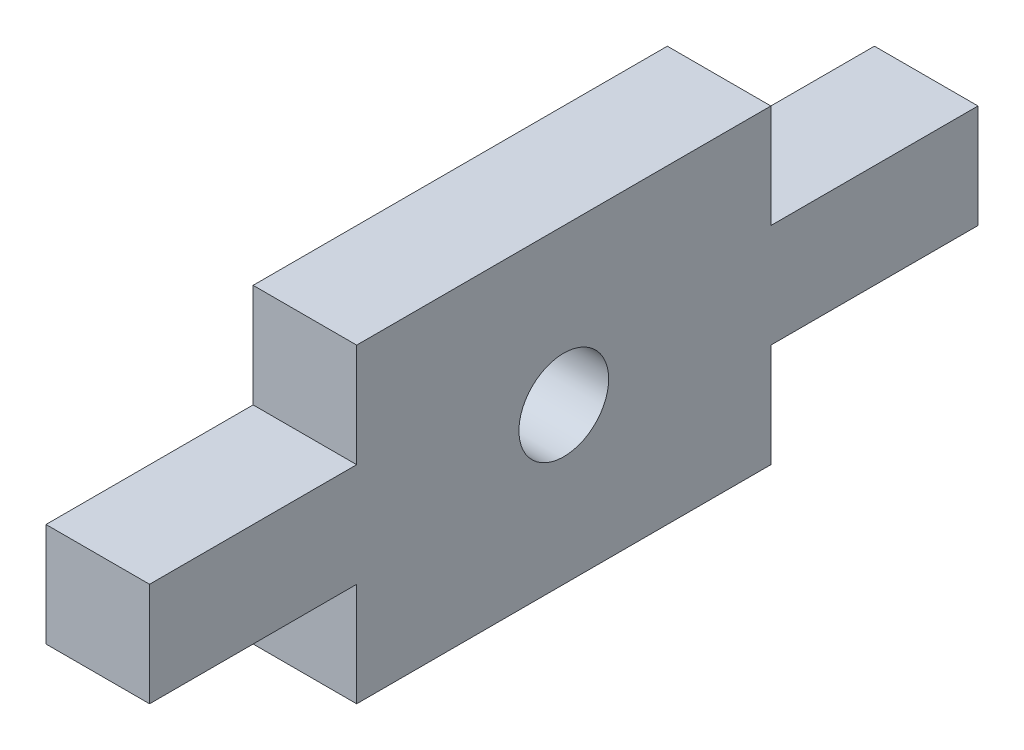
ISO-10303-21;
HEADER;
FILE_DESCRIPTION(('STEP AP214'),'2;1');
FILE_NAME('part.step','',(''),(''),'','','');
FILE_SCHEMA(('AUTOMOTIVE_DESIGN { 1 0 10303 214 1 1 1 1 }'));
ENDSEC;
DATA;
#1=APPLICATION_CONTEXT('core data for automotive mechanical design processes');
#2=APPLICATION_PROTOCOL_DEFINITION('international standard','automotive_design',2000,#1);
#3=PRODUCT_CONTEXT('',#1,'mechanical');
#4=PRODUCT('Part','Part','',(#3));
#5=PRODUCT_RELATED_PRODUCT_CATEGORY('part','',(#4));
#6=PRODUCT_DEFINITION_FORMATION('','',#4);
#7=PRODUCT_DEFINITION_CONTEXT('part definition',#1,'design');
#8=PRODUCT_DEFINITION('design','',#6,#7);
#9=PRODUCT_DEFINITION_SHAPE('','',#8);
#10=(LENGTH_UNIT() NAMED_UNIT(*) SI_UNIT(.MILLI.,.METRE.));
#11=(NAMED_UNIT(*) PLANE_ANGLE_UNIT() SI_UNIT($,.RADIAN.));
#12=(NAMED_UNIT(*) SI_UNIT($,.STERADIAN.) SOLID_ANGLE_UNIT());
#13=UNCERTAINTY_MEASURE_WITH_UNIT(LENGTH_MEASURE(1.E-05),#10,'distance_accuracy_value','');
#14=(GEOMETRIC_REPRESENTATION_CONTEXT(3) GLOBAL_UNCERTAINTY_ASSIGNED_CONTEXT((#13)) GLOBAL_UNIT_ASSIGNED_CONTEXT((#10,
#11,#12)) REPRESENTATION_CONTEXT('',''));
#15=CARTESIAN_POINT('',(0.,0.,0.));
#16=DIRECTION('',(0.,0.,1.));
#17=DIRECTION('',(1.,0.,0.));
#18=AXIS2_PLACEMENT_3D('',#15,#16,#17);
#19=CARTESIAN_POINT('',(3.,0.,-6.));
#20=DIRECTION('',(0.,0.,-1.));
#21=DIRECTION('',(-1.,0.,0.));
#22=AXIS2_PLACEMENT_3D('',#19,#20,#21);
#23=PLANE('',#22);
#24=DIRECTION('',(0.,-1.,0.));
#25=VECTOR('',#24,1.);
#26=CARTESIAN_POINT('',(0.,0.,-6.));
#27=LINE('',#26,#25);
#28=CARTESIAN_POINT('',(0.,4.5,-6.));
#29=VERTEX_POINT('',#28);
#30=CARTESIAN_POINT('',(0.,1.5,-6.));
#31=VERTEX_POINT('',#30);
#32=EDGE_CURVE('E154',#29,#31,#27,.T.);
#33=ORIENTED_EDGE('',*,*,#32,.F.);
#34=DIRECTION('',(-1.,0.,0.));
#35=VECTOR('',#34,1.);
#36=CARTESIAN_POINT('',(3.,4.5,-6.));
#37=LINE('',#36,#35);
#38=CARTESIAN_POINT('',(3.,4.5,-6.));
#39=VERTEX_POINT('',#38);
#40=EDGE_CURVE('E11',#39,#29,#37,.T.);
#41=ORIENTED_EDGE('',*,*,#40,.F.);
#42=DIRECTION('',(0.,-1.,0.));
#43=VECTOR('',#42,1.);
#44=CARTESIAN_POINT('',(3.,0.,-6.));
#45=LINE('',#44,#43);
#46=CARTESIAN_POINT('',(3.,1.5,-6.));
#47=VERTEX_POINT('',#46);
#48=EDGE_CURVE('E214',#39,#47,#45,.T.);
#49=ORIENTED_EDGE('',*,*,#48,.T.);
#50=DIRECTION('',(-1.,0.,0.));
#51=VECTOR('',#50,1.);
#52=CARTESIAN_POINT('',(3.,1.5,-6.));
#53=LINE('',#52,#51);
#54=EDGE_CURVE('E50',#47,#31,#53,.T.);
#55=ORIENTED_EDGE('',*,*,#54,.T.);
#56=EDGE_LOOP('',(#33,#41,#49,#55));
#57=FACE_BOUND('',#56,.T.);
#58=ADVANCED_FACE('F34',(#57),#23,.T.);
#59=CARTESIAN_POINT('',(3.,4.5,0.));
#60=DIRECTION('',(0.,1.,0.));
#61=DIRECTION('',(0.,0.,1.));
#62=AXIS2_PLACEMENT_3D('',#59,#60,#61);
#63=PLANE('',#62);
#64=DIRECTION('',(0.,0.,-1.));
#65=VECTOR('',#64,1.);
#66=CARTESIAN_POINT('',(0.,4.5,0.));
#67=LINE('',#66,#65);
#68=CARTESIAN_POINT('',(0.,4.5,6.));
#69=VERTEX_POINT('',#68);
#70=EDGE_CURVE('E156',#69,#29,#67,.T.);
#71=ORIENTED_EDGE('',*,*,#70,.F.);
#72=DIRECTION('',(-1.,0.,0.));
#73=VECTOR('',#72,1.);
#74=CARTESIAN_POINT('',(3.,4.5,6.));
#75=LINE('',#74,#73);
#76=CARTESIAN_POINT('',(3.,4.5,6.));
#77=VERTEX_POINT('',#76);
#78=EDGE_CURVE('E42',#77,#69,#75,.T.);
#79=ORIENTED_EDGE('',*,*,#78,.F.);
#80=DIRECTION('',(0.,0.,-1.));
#81=VECTOR('',#80,1.);
#82=CARTESIAN_POINT('',(3.,4.5,0.));
#83=LINE('',#82,#81);
#84=EDGE_CURVE('E211',#77,#39,#83,.T.);
#85=ORIENTED_EDGE('',*,*,#84,.T.);
#86=ORIENTED_EDGE('',*,*,#40,.T.);
#87=EDGE_LOOP('',(#71,#79,#85,#86));
#88=FACE_BOUND('',#87,.T.);
#89=ADVANCED_FACE('F210',(#88),#63,.T.);
#90=CARTESIAN_POINT('',(3.,0.,6.));
#91=DIRECTION('',(0.,0.,-1.));
#92=DIRECTION('',(-1.,0.,0.));
#93=AXIS2_PLACEMENT_3D('',#90,#91,#92);
#94=PLANE('',#93);
#95=DIRECTION('',(0.,-1.,0.));
#96=VECTOR('',#95,1.);
#97=CARTESIAN_POINT('',(0.,0.,6.));
#98=LINE('',#97,#96);
#99=CARTESIAN_POINT('',(0.,1.5,6.));
#100=VERTEX_POINT('',#99);
#101=EDGE_CURVE('E160',#69,#100,#98,.T.);
#102=ORIENTED_EDGE('',*,*,#101,.T.);
#103=DIRECTION('',(-1.,0.,0.));
#104=VECTOR('',#103,1.);
#105=CARTESIAN_POINT('',(3.,1.5,6.));
#106=LINE('',#105,#104);
#107=CARTESIAN_POINT('',(3.,1.5,6.));
#108=VERTEX_POINT('',#107);
#109=EDGE_CURVE('E196',#108,#100,#106,.T.);
#110=ORIENTED_EDGE('',*,*,#109,.F.);
#111=DIRECTION('',(0.,-1.,0.));
#112=VECTOR('',#111,1.);
#113=CARTESIAN_POINT('',(3.,0.,6.));
#114=LINE('',#113,#112);
#115=EDGE_CURVE('E202',#77,#108,#114,.T.);
#116=ORIENTED_EDGE('',*,*,#115,.F.);
#117=ORIENTED_EDGE('',*,*,#78,.T.);
#118=EDGE_LOOP('',(#102,#110,#116,#117));
#119=FACE_BOUND('',#118,.T.);
#120=ADVANCED_FACE('F200',(#119),#94,.F.);
#121=CARTESIAN_POINT('',(3.,1.5,0.));
#122=DIRECTION('',(0.,1.,0.));
#123=DIRECTION('',(0.,0.,1.));
#124=AXIS2_PLACEMENT_3D('',#121,#122,#123);
#125=PLANE('',#124);
#126=DIRECTION('',(0.,0.,-1.));
#127=VECTOR('',#126,1.);
#128=CARTESIAN_POINT('',(0.,1.5,0.));
#129=LINE('',#128,#127);
#130=CARTESIAN_POINT('',(0.,1.5,12.));
#131=VERTEX_POINT('',#130);
#132=EDGE_CURVE('E163',#131,#100,#129,.T.);
#133=ORIENTED_EDGE('',*,*,#132,.F.);
#134=DIRECTION('',(-1.,0.,0.));
#135=VECTOR('',#134,1.);
#136=CARTESIAN_POINT('',(3.,1.5,12.));
#137=LINE('',#136,#135);
#138=CARTESIAN_POINT('',(3.,1.5,12.));
#139=VERTEX_POINT('',#138);
#140=EDGE_CURVE('E194',#139,#131,#137,.T.);
#141=ORIENTED_EDGE('',*,*,#140,.F.);
#142=DIRECTION('',(0.,0.,-1.));
#143=VECTOR('',#142,1.);
#144=CARTESIAN_POINT('',(3.,1.5,0.));
#145=LINE('',#144,#143);
#146=EDGE_CURVE('E150',#139,#108,#145,.T.);
#147=ORIENTED_EDGE('',*,*,#146,.T.);
#148=ORIENTED_EDGE('',*,*,#109,.T.);
#149=EDGE_LOOP('',(#133,#141,#147,#148));
#150=FACE_BOUND('',#149,.T.);
#151=ADVANCED_FACE('F251',(#150),#125,.T.);
#152=CARTESIAN_POINT('',(3.,0.,12.));
#153=DIRECTION('',(0.,0.,1.));
#154=DIRECTION('',(1.,0.,0.));
#155=AXIS2_PLACEMENT_3D('',#152,#153,#154);
#156=PLANE('',#155);
#157=DIRECTION('',(0.,1.,0.));
#158=VECTOR('',#157,1.);
#159=CARTESIAN_POINT('',(0.,0.,12.));
#160=LINE('',#159,#158);
#161=CARTESIAN_POINT('',(0.,-1.5,12.));
#162=VERTEX_POINT('',#161);
#163=EDGE_CURVE('E166',#162,#131,#160,.T.);
#164=ORIENTED_EDGE('',*,*,#163,.F.);
#165=DIRECTION('',(-1.,0.,0.));
#166=VECTOR('',#165,1.);
#167=CARTESIAN_POINT('',(3.,-1.5,12.));
#168=LINE('',#167,#166);
#169=CARTESIAN_POINT('',(3.,-1.5,12.));
#170=VERTEX_POINT('',#169);
#171=EDGE_CURVE('E192',#170,#162,#168,.T.);
#172=ORIENTED_EDGE('',*,*,#171,.F.);
#173=DIRECTION('',(0.,1.,0.));
#174=VECTOR('',#173,1.);
#175=CARTESIAN_POINT('',(3.,0.,12.));
#176=LINE('',#175,#174);
#177=EDGE_CURVE('E222',#170,#139,#176,.T.);
#178=ORIENTED_EDGE('',*,*,#177,.T.);
#179=ORIENTED_EDGE('',*,*,#140,.T.);
#180=EDGE_LOOP('',(#164,#172,#178,#179));
#181=FACE_BOUND('',#180,.T.);
#182=ADVANCED_FACE('F247',(#181),#156,.T.);
#183=CARTESIAN_POINT('',(3.,-1.5,0.));
#184=DIRECTION('',(0.,1.,0.));
#185=DIRECTION('',(0.,0.,1.));
#186=AXIS2_PLACEMENT_3D('',#183,#184,#185);
#187=PLANE('',#186);
#188=DIRECTION('',(0.,0.,-1.));
#189=VECTOR('',#188,1.);
#190=CARTESIAN_POINT('',(0.,-1.5,0.));
#191=LINE('',#190,#189);
#192=CARTESIAN_POINT('',(0.,-1.5,6.));
#193=VERTEX_POINT('',#192);
#194=EDGE_CURVE('E170',#162,#193,#191,.T.);
#195=ORIENTED_EDGE('',*,*,#194,.T.);
#196=DIRECTION('',(-1.,0.,0.));
#197=VECTOR('',#196,1.);
#198=CARTESIAN_POINT('',(3.,-1.5,6.));
#199=LINE('',#198,#197);
#200=CARTESIAN_POINT('',(3.,-1.5,6.));
#201=VERTEX_POINT('',#200);
#202=EDGE_CURVE('E190',#201,#193,#199,.T.);
#203=ORIENTED_EDGE('',*,*,#202,.F.);
#204=DIRECTION('',(0.,0.,-1.));
#205=VECTOR('',#204,1.);
#206=CARTESIAN_POINT('',(3.,-1.5,0.));
#207=LINE('',#206,#205);
#208=EDGE_CURVE('E136',#170,#201,#207,.T.);
#209=ORIENTED_EDGE('',*,*,#208,.F.);
#210=ORIENTED_EDGE('',*,*,#171,.T.);
#211=EDGE_LOOP('',(#195,#203,#209,#210));
#212=FACE_BOUND('',#211,.T.);
#213=ADVANCED_FACE('F244',(#212),#187,.F.);
#214=CARTESIAN_POINT('',(3.,0.,6.));
#215=DIRECTION('',(0.,0.,1.));
#216=DIRECTION('',(1.,0.,0.));
#217=AXIS2_PLACEMENT_3D('',#214,#215,#216);
#218=PLANE('',#217);
#219=DIRECTION('',(0.,1.,0.));
#220=VECTOR('',#219,1.);
#221=CARTESIAN_POINT('',(0.,0.,6.));
#222=LINE('',#221,#220);
#223=CARTESIAN_POINT('',(0.,-4.5,6.));
#224=VERTEX_POINT('',#223);
#225=EDGE_CURVE('E173',#224,#193,#222,.T.);
#226=ORIENTED_EDGE('',*,*,#225,.F.);
#227=DIRECTION('',(-1.,0.,0.));
#228=VECTOR('',#227,1.);
#229=CARTESIAN_POINT('',(3.,-4.5,6.));
#230=LINE('',#229,#228);
#231=CARTESIAN_POINT('',(3.,-4.5,6.));
#232=VERTEX_POINT('',#231);
#233=EDGE_CURVE('E188',#232,#224,#230,.T.);
#234=ORIENTED_EDGE('',*,*,#233,.F.);
#235=DIRECTION('',(0.,1.,0.));
#236=VECTOR('',#235,1.);
#237=CARTESIAN_POINT('',(3.,0.,6.));
#238=LINE('',#237,#236);
#239=EDGE_CURVE('E225',#232,#201,#238,.T.);
#240=ORIENTED_EDGE('',*,*,#239,.T.);
#241=ORIENTED_EDGE('',*,*,#202,.T.);
#242=EDGE_LOOP('',(#226,#234,#240,#241));
#243=FACE_BOUND('',#242,.T.);
#244=ADVANCED_FACE('F240',(#243),#218,.T.);
#245=CARTESIAN_POINT('',(3.,-4.5,0.));
#246=DIRECTION('',(0.,1.,0.));
#247=DIRECTION('',(0.,0.,1.));
#248=AXIS2_PLACEMENT_3D('',#245,#246,#247);
#249=PLANE('',#248);
#250=DIRECTION('',(0.,0.,-1.));
#251=VECTOR('',#250,1.);
#252=CARTESIAN_POINT('',(0.,-4.5,0.));
#253=LINE('',#252,#251);
#254=CARTESIAN_POINT('',(0.,-4.5,-6.));
#255=VERTEX_POINT('',#254);
#256=EDGE_CURVE('E176',#224,#255,#253,.T.);
#257=ORIENTED_EDGE('',*,*,#256,.T.);
#258=DIRECTION('',(-1.,0.,0.));
#259=VECTOR('',#258,1.);
#260=CARTESIAN_POINT('',(3.,-4.5,-6.));
#261=LINE('',#260,#259);
#262=CARTESIAN_POINT('',(3.,-4.5,-6.));
#263=VERTEX_POINT('',#262);
#264=EDGE_CURVE('E185',#263,#255,#261,.T.);
#265=ORIENTED_EDGE('',*,*,#264,.F.);
#266=DIRECTION('',(0.,0.,-1.));
#267=VECTOR('',#266,1.);
#268=CARTESIAN_POINT('',(3.,-4.5,0.));
#269=LINE('',#268,#267);
#270=EDGE_CURVE('E227',#232,#263,#269,.T.);
#271=ORIENTED_EDGE('',*,*,#270,.F.);
#272=ORIENTED_EDGE('',*,*,#233,.T.);
#273=EDGE_LOOP('',(#257,#265,#271,#272));
#274=FACE_BOUND('',#273,.T.);
#275=ADVANCED_FACE('F232',(#274),#249,.F.);
#276=CARTESIAN_POINT('',(3.,0.,-6.));
#277=DIRECTION('',(0.,0.,1.));
#278=DIRECTION('',(1.,0.,0.));
#279=AXIS2_PLACEMENT_3D('',#276,#277,#278);
#280=PLANE('',#279);
#281=DIRECTION('',(0.,1.,0.));
#282=VECTOR('',#281,1.);
#283=CARTESIAN_POINT('',(0.,0.,-6.));
#284=LINE('',#283,#282);
#285=CARTESIAN_POINT('',(0.,-1.5,-6.));
#286=VERTEX_POINT('',#285);
#287=EDGE_CURVE('E178',#255,#286,#284,.T.);
#288=ORIENTED_EDGE('',*,*,#287,.T.);
#289=DIRECTION('',(-1.,0.,0.));
#290=VECTOR('',#289,1.);
#291=CARTESIAN_POINT('',(3.,-1.5,-6.));
#292=LINE('',#291,#290);
#293=CARTESIAN_POINT('',(3.,-1.5,-6.));
#294=VERTEX_POINT('',#293);
#295=EDGE_CURVE('E144',#294,#286,#292,.T.);
#296=ORIENTED_EDGE('',*,*,#295,.F.);
#297=DIRECTION('',(0.,1.,0.));
#298=VECTOR('',#297,1.);
#299=CARTESIAN_POINT('',(3.,0.,-6.));
#300=LINE('',#299,#298);
#301=EDGE_CURVE('E131',#263,#294,#300,.T.);
#302=ORIENTED_EDGE('',*,*,#301,.F.);
#303=ORIENTED_EDGE('',*,*,#264,.T.);
#304=EDGE_LOOP('',(#288,#296,#302,#303));
#305=FACE_BOUND('',#304,.T.);
#306=ADVANCED_FACE('F236',(#305),#280,.F.);
#307=CARTESIAN_POINT('',(0.,-1.5,-12.));
#308=VERTEX_POINT('',#307);
#309=EDGE_CURVE('E141',#286,#308,#191,.T.);
#310=ORIENTED_EDGE('',*,*,#309,.T.);
#311=DIRECTION('',(-1.,0.,0.));
#312=VECTOR('',#311,1.);
#313=CARTESIAN_POINT('',(3.,-1.5,-12.));
#314=LINE('',#313,#312);
#315=CARTESIAN_POINT('',(3.,-1.5,-12.));
#316=VERTEX_POINT('',#315);
#317=EDGE_CURVE('E138',#316,#308,#314,.T.);
#318=ORIENTED_EDGE('',*,*,#317,.F.);
#319=EDGE_CURVE('E124',#294,#316,#207,.T.);
#320=ORIENTED_EDGE('',*,*,#319,.F.);
#321=ORIENTED_EDGE('',*,*,#295,.T.);
#322=EDGE_LOOP('',(#310,#318,#320,#321));
#323=FACE_BOUND('',#322,.T.);
#324=ADVANCED_FACE('F139',(#323),#187,.F.);
#325=CARTESIAN_POINT('',(3.,0.,-12.));
#326=DIRECTION('',(0.,0.,1.));
#327=DIRECTION('',(1.,0.,0.));
#328=AXIS2_PLACEMENT_3D('',#325,#326,#327);
#329=PLANE('',#328);
#330=DIRECTION('',(0.,1.,0.));
#331=VECTOR('',#330,1.);
#332=CARTESIAN_POINT('',(0.,0.,-12.));
#333=LINE('',#332,#331);
#334=CARTESIAN_POINT('',(0.,1.5,-12.));
#335=VERTEX_POINT('',#334);
#336=EDGE_CURVE('E180',#308,#335,#333,.T.);
#337=ORIENTED_EDGE('',*,*,#336,.T.);
#338=DIRECTION('',(-1.,0.,0.));
#339=VECTOR('',#338,1.);
#340=CARTESIAN_POINT('',(3.,1.5,-12.));
#341=LINE('',#340,#339);
#342=CARTESIAN_POINT('',(3.,1.5,-12.));
#343=VERTEX_POINT('',#342);
#344=EDGE_CURVE('E88',#343,#335,#341,.T.);
#345=ORIENTED_EDGE('',*,*,#344,.F.);
#346=DIRECTION('',(0.,1.,0.));
#347=VECTOR('',#346,1.);
#348=CARTESIAN_POINT('',(3.,0.,-12.));
#349=LINE('',#348,#347);
#350=EDGE_CURVE('E129',#316,#343,#349,.T.);
#351=ORIENTED_EDGE('',*,*,#350,.F.);
#352=ORIENTED_EDGE('',*,*,#317,.T.);
#353=EDGE_LOOP('',(#337,#345,#351,#352));
#354=FACE_BOUND('',#353,.T.);
#355=ADVANCED_FACE('F146',(#354),#329,.F.);
#356=EDGE_CURVE('E167',#31,#335,#129,.T.);
#357=ORIENTED_EDGE('',*,*,#356,.F.);
#358=ORIENTED_EDGE('',*,*,#54,.F.);
#359=EDGE_CURVE('E147',#47,#343,#145,.T.);
#360=ORIENTED_EDGE('',*,*,#359,.T.);
#361=ORIENTED_EDGE('',*,*,#344,.T.);
#362=EDGE_LOOP('',(#357,#358,#360,#361));
#363=FACE_BOUND('',#362,.T.);
#364=ADVANCED_FACE('F213',(#363),#125,.T.);
#365=CARTESIAN_POINT('',(3.,0.,0.));
#366=DIRECTION('',(1.,0.,0.));
#367=DIRECTION('',(0.,0.,-1.));
#368=AXIS2_PLACEMENT_3D('',#365,#366,#367);
#369=PLANE('',#368);
#370=CARTESIAN_POINT('',(3.,0.,0.));
#371=DIRECTION('',(1.,0.,0.));
#372=DIRECTION('',(0.,0.,-1.));
#373=AXIS2_PLACEMENT_3D('',#370,#371,#372);
#374=CIRCLE('',#373,1.3);
#375=CARTESIAN_POINT('',(3.,0.,-1.3));
#376=VERTEX_POINT('',#375);
#377=EDGE_CURVE('E401',#376,#376,#374,.T.);
#378=ORIENTED_EDGE('',*,*,#377,.F.);
#379=EDGE_LOOP('',(#378));
#380=FACE_BOUND('',#379,.T.);
#381=ORIENTED_EDGE('',*,*,#48,.F.);
#382=ORIENTED_EDGE('',*,*,#84,.F.);
#383=ORIENTED_EDGE('',*,*,#115,.T.);
#384=ORIENTED_EDGE('',*,*,#146,.F.);
#385=ORIENTED_EDGE('',*,*,#177,.F.);
#386=ORIENTED_EDGE('',*,*,#208,.T.);
#387=ORIENTED_EDGE('',*,*,#239,.F.);
#388=ORIENTED_EDGE('',*,*,#270,.T.);
#389=ORIENTED_EDGE('',*,*,#301,.T.);
#390=ORIENTED_EDGE('',*,*,#319,.T.);
#391=ORIENTED_EDGE('',*,*,#350,.T.);
#392=ORIENTED_EDGE('',*,*,#359,.F.);
#393=EDGE_LOOP('',(#381,#382,#383,#384,#385,#386,#387,#388,#389,#390,#391,#392));
#394=FACE_BOUND('',#393,.T.);
#395=ADVANCED_FACE('F126',(#380,#394),#369,.T.);
#396=CARTESIAN_POINT('',(0.,0.,0.));
#397=DIRECTION('',(1.,0.,0.));
#398=DIRECTION('',(0.,0.,-1.));
#399=AXIS2_PLACEMENT_3D('',#396,#397,#398);
#400=PLANE('',#399);
#401=CARTESIAN_POINT('',(0.,0.,0.));
#402=DIRECTION('',(1.,0.,0.));
#403=DIRECTION('',(0.,0.,-1.));
#404=AXIS2_PLACEMENT_3D('',#401,#402,#403);
#405=CIRCLE('',#404,1.3);
#406=CARTESIAN_POINT('',(0.,0.,-1.3));
#407=VERTEX_POINT('',#406);
#408=EDGE_CURVE('E157',#407,#407,#405,.T.);
#409=ORIENTED_EDGE('',*,*,#408,.T.);
#410=EDGE_LOOP('',(#409));
#411=FACE_BOUND('',#410,.T.);
#412=ORIENTED_EDGE('',*,*,#32,.T.);
#413=ORIENTED_EDGE('',*,*,#356,.T.);
#414=ORIENTED_EDGE('',*,*,#336,.F.);
#415=ORIENTED_EDGE('',*,*,#309,.F.);
#416=ORIENTED_EDGE('',*,*,#287,.F.);
#417=ORIENTED_EDGE('',*,*,#256,.F.);
#418=ORIENTED_EDGE('',*,*,#225,.T.);
#419=ORIENTED_EDGE('',*,*,#194,.F.);
#420=ORIENTED_EDGE('',*,*,#163,.T.);
#421=ORIENTED_EDGE('',*,*,#132,.T.);
#422=ORIENTED_EDGE('',*,*,#101,.F.);
#423=ORIENTED_EDGE('',*,*,#70,.T.);
#424=EDGE_LOOP('',(#412,#413,#414,#415,#416,#417,#418,#419,#420,#421,#422,#423));
#425=FACE_BOUND('',#424,.T.);
#426=ADVANCED_FACE('F208',(#411,#425),#400,.F.);
#427=CARTESIAN_POINT('',(3.,0.,0.));
#428=DIRECTION('',(1.,0.,0.));
#429=DIRECTION('',(0.,0.,-1.));
#430=AXIS2_PLACEMENT_3D('',#427,#428,#429);
#431=CYLINDRICAL_SURFACE('',#430,1.3);
#432=ORIENTED_EDGE('',*,*,#408,.F.);
#433=EDGE_LOOP('',(#432));
#434=FACE_BOUND('',#433,.T.);
#435=ORIENTED_EDGE('',*,*,#377,.T.);
#436=EDGE_LOOP('',(#435));
#437=FACE_BOUND('',#436,.T.);
#438=ADVANCED_FACE('F299',(#434,#437),#431,.F.);
#439=CLOSED_SHELL('',(#58,#89,#120,#151,#182,#213,#244,#275,#306,#324,#355,#364,#395,#426,#438));
#440=MANIFOLD_SOLID_BREP('B2',#439);
#441=ADVANCED_BREP_SHAPE_REPRESENTATION('',(#18,#440),#14);
#442=SHAPE_DEFINITION_REPRESENTATION(#9,#441);
ENDSEC;
END-ISO-10303-21;
